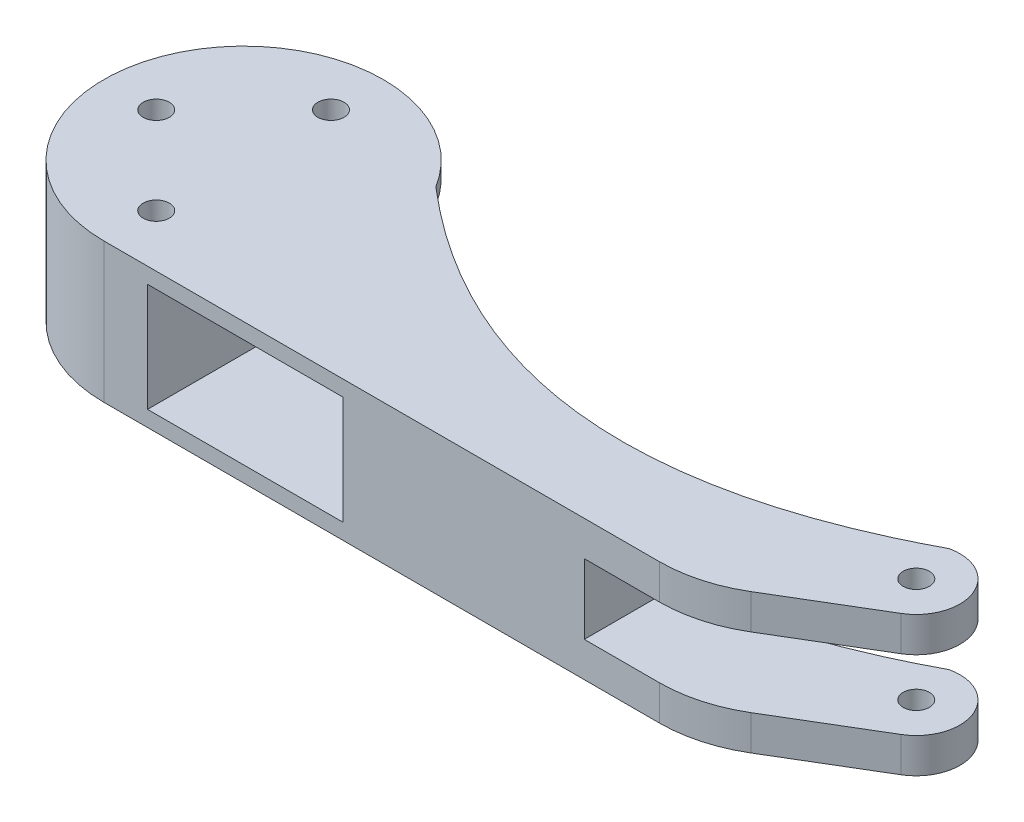
ISO-10303-21;
HEADER;
FILE_DESCRIPTION(('STEP AP214'),'2;1');
FILE_NAME('part.step','',(''),(''),'','','');
FILE_SCHEMA(('AUTOMOTIVE_DESIGN { 1 0 10303 214 1 1 1 1 }'));
ENDSEC;
DATA;
#1=APPLICATION_CONTEXT('core data for automotive mechanical design processes');
#2=APPLICATION_PROTOCOL_DEFINITION('international standard','automotive_design',2000,#1);
#3=PRODUCT_CONTEXT('',#1,'mechanical');
#4=PRODUCT('Part','Part','',(#3));
#5=PRODUCT_RELATED_PRODUCT_CATEGORY('part','',(#4));
#6=PRODUCT_DEFINITION_FORMATION('','',#4);
#7=PRODUCT_DEFINITION_CONTEXT('part definition',#1,'design');
#8=PRODUCT_DEFINITION('design','',#6,#7);
#9=PRODUCT_DEFINITION_SHAPE('','',#8);
#10=(LENGTH_UNIT() NAMED_UNIT(*) SI_UNIT(.MILLI.,.METRE.));
#11=(NAMED_UNIT(*) PLANE_ANGLE_UNIT() SI_UNIT($,.RADIAN.));
#12=(NAMED_UNIT(*) SI_UNIT($,.STERADIAN.) SOLID_ANGLE_UNIT());
#13=UNCERTAINTY_MEASURE_WITH_UNIT(LENGTH_MEASURE(1.E-05),#10,'distance_accuracy_value','');
#14=(GEOMETRIC_REPRESENTATION_CONTEXT(3) GLOBAL_UNCERTAINTY_ASSIGNED_CONTEXT((#13)) GLOBAL_UNIT_ASSIGNED_CONTEXT((#10,
#11,#12)) REPRESENTATION_CONTEXT('',''));
#15=CARTESIAN_POINT('',(0.,0.,0.));
#16=DIRECTION('',(0.,0.,1.));
#17=DIRECTION('',(1.,0.,0.));
#18=AXIS2_PLACEMENT_3D('',#15,#16,#17);
#19=CARTESIAN_POINT('',(7.56845608489065,16.,-14.0967539700132));
#20=CARTESIAN_POINT('',(39.625972236992,16.,19.0319670427114));
#21=CARTESIAN_POINT('',(78.8682656729972,16.,-1.87023381503225));
#22=B_SPLINE_CURVE_WITH_KNOTS('',2,(#19,#20,#21),.UNSPECIFIED.,.F.,.F.,(3,3),(0.,1.),.UNSPECIFIED.);
#23=DIRECTION('',(0.,-1.,0.));
#24=VECTOR('',#23,1.);
#25=SURFACE_OF_LINEAR_EXTRUSION('',#22,#24);
#26=DIRECTION('',(0.,-1.,0.));
#27=VECTOR('',#26,1.);
#28=CARTESIAN_POINT('',(27.4,16.,0.893138669633792));
#29=LINE('',#28,#27);
#30=CARTESIAN_POINT('',(27.4,1.8,0.893138669401314));
#31=VERTEX_POINT('',#30);
#32=CARTESIAN_POINT('',(27.4,14.2,0.893138669633791));
#33=VERTEX_POINT('',#32);
#34=EDGE_CURVE('E211',#31,#33,#29,.F.);
#35=ORIENTED_EDGE('',*,*,#34,.T.);
#36=CARTESIAN_POINT('',(7.56845608489065,14.2,-14.0967539700132));
#37=CARTESIAN_POINT('',(39.625972236992,14.2,19.0319670427114));
#38=CARTESIAN_POINT('',(78.8682656729972,14.2,-1.87023381503225));
#39=B_SPLINE_CURVE_WITH_KNOTS('',2,(#36,#37,#38),.UNSPECIFIED.,.F.,.F.,(3,3),(0.,1.),.UNSPECIFIED.);
#40=CARTESIAN_POINT('',(13.6420523189909,14.2,-8.36028758631638));
#41=VERTEX_POINT('',#40);
#42=EDGE_CURVE('E202',#33,#41,#39,.F.);
#43=ORIENTED_EDGE('',*,*,#42,.T.);
#44=DIRECTION('',(0.,-1.,0.));
#45=VECTOR('',#44,1.);
#46=CARTESIAN_POINT('',(13.6420523189909,16.,-8.36028758631638));
#47=LINE('',#46,#45);
#48=CARTESIAN_POINT('',(13.6420523189909,16.,-8.36028758631638));
#49=VERTEX_POINT('',#48);
#50=EDGE_CURVE('E403',#49,#41,#47,.T.);
#51=ORIENTED_EDGE('',*,*,#50,.F.);
#52=CARTESIAN_POINT('',(78.8682656729973,16.,-1.87023381503226));
#53=VERTEX_POINT('',#52);
#54=EDGE_CURVE('E284',#49,#53,#22,.T.);
#55=ORIENTED_EDGE('',*,*,#54,.T.);
#56=DIRECTION('',(0.,-1.,0.));
#57=VECTOR('',#56,1.);
#58=CARTESIAN_POINT('',(78.8682656729973,16.,-1.87023381503226));
#59=LINE('',#58,#57);
#60=CARTESIAN_POINT('',(78.8682656729973,12.,-1.87023381503226));
#61=VERTEX_POINT('',#60);
#62=EDGE_CURVE('E348',#53,#61,#59,.T.);
#63=ORIENTED_EDGE('',*,*,#62,.T.);
#64=CARTESIAN_POINT('',(7.56845608489065,12.,-14.0967539700132));
#65=CARTESIAN_POINT('',(39.625972236992,12.,19.0319670427114));
#66=CARTESIAN_POINT('',(78.8682656729972,12.,-1.87023381503225));
#67=B_SPLINE_CURVE_WITH_KNOTS('',2,(#64,#65,#66),.UNSPECIFIED.,.F.,.F.,(3,3),(0.,1.),.UNSPECIFIED.);
#68=CARTESIAN_POINT('',(55.,12.,5.92188664032105));
#69=VERTEX_POINT('',#68);
#70=EDGE_CURVE('E260',#61,#69,#67,.F.);
#71=ORIENTED_EDGE('',*,*,#70,.T.);
#72=DIRECTION('',(0.,-1.,0.));
#73=VECTOR('',#72,1.);
#74=CARTESIAN_POINT('',(55.,16.,5.92188664028552));
#75=LINE('',#74,#73);
#76=CARTESIAN_POINT('',(55.,4.,5.92188664032105));
#77=VERTEX_POINT('',#76);
#78=EDGE_CURVE('E273',#77,#69,#75,.F.);
#79=ORIENTED_EDGE('',*,*,#78,.F.);
#80=CARTESIAN_POINT('',(7.56845608489065,4.,-14.0967539700132));
#81=CARTESIAN_POINT('',(39.625972236992,4.,19.0319670427114));
#82=CARTESIAN_POINT('',(78.8682656729972,4.,-1.87023381503225));
#83=B_SPLINE_CURVE_WITH_KNOTS('',2,(#80,#81,#82),.UNSPECIFIED.,.F.,.F.,(3,3),(0.,1.),.UNSPECIFIED.);
#84=CARTESIAN_POINT('',(78.8682656729973,4.,-1.87023381503226));
#85=VERTEX_POINT('',#84);
#86=EDGE_CURVE('E242',#85,#77,#83,.F.);
#87=ORIENTED_EDGE('',*,*,#86,.F.);
#88=CARTESIAN_POINT('',(78.8682656729973,0.,-1.87023381503226));
#89=VERTEX_POINT('',#88);
#90=EDGE_CURVE('E401',#85,#89,#59,.T.);
#91=ORIENTED_EDGE('',*,*,#90,.T.);
#92=CARTESIAN_POINT('',(7.56845608489065,0.,-14.0967539700132));
#93=CARTESIAN_POINT('',(39.625972236992,0.,19.0319670427114));
#94=CARTESIAN_POINT('',(78.8682656729972,0.,-1.87023381503225));
#95=B_SPLINE_CURVE_WITH_KNOTS('',2,(#92,#93,#94),.UNSPECIFIED.,.F.,.F.,(3,3),(0.,1.),.UNSPECIFIED.);
#96=CARTESIAN_POINT('',(13.6420523189909,0.,-8.36028758631638));
#97=VERTEX_POINT('',#96);
#98=EDGE_CURVE('E425',#97,#89,#95,.T.);
#99=ORIENTED_EDGE('',*,*,#98,.F.);
#100=CARTESIAN_POINT('',(13.6420523189909,1.8,-8.36028758631638));
#101=VERTEX_POINT('',#100);
#102=EDGE_CURVE('E408',#101,#97,#47,.T.);
#103=ORIENTED_EDGE('',*,*,#102,.F.);
#104=CARTESIAN_POINT('',(7.56845608489065,1.8,-14.0967539700132));
#105=CARTESIAN_POINT('',(39.625972236992,1.8,19.0319670427114));
#106=CARTESIAN_POINT('',(78.8682656729972,1.8,-1.87023381503225));
#107=B_SPLINE_CURVE_WITH_KNOTS('',2,(#104,#105,#106),.UNSPECIFIED.,.F.,.F.,(3,3),(0.,1.),.UNSPECIFIED.);
#108=EDGE_CURVE('E192',#101,#31,#107,.T.);
#109=ORIENTED_EDGE('',*,*,#108,.T.);
#110=EDGE_LOOP('',(#35,#43,#51,#55,#63,#71,#79,#87,#91,#99,#103,#109));
#111=FACE_BOUND('',#110,.T.);
#112=ADVANCED_FACE('F44',(#111),#25,.T.);
#113=CARTESIAN_POINT('',(0.,16.,16.));
#114=DIRECTION('',(0.,0.,-1.));
#115=DIRECTION('',(-1.,0.,0.));
#116=AXIS2_PLACEMENT_3D('',#113,#114,#115);
#117=PLANE('',#116);
#118=DIRECTION('',(1.,0.,0.));
#119=VECTOR('',#118,1.);
#120=CARTESIAN_POINT('',(55.,12.,16.));
#121=LINE('',#120,#119);
#122=CARTESIAN_POINT('',(55.,12.,16.));
#123=VERTEX_POINT('',#122);
#124=CARTESIAN_POINT('',(63.5817220013536,12.,16.));
#125=VERTEX_POINT('',#124);
#126=EDGE_CURVE('E225',#123,#125,#121,.T.);
#127=ORIENTED_EDGE('',*,*,#126,.T.);
#128=DIRECTION('',(0.,-1.,0.));
#129=VECTOR('',#128,1.);
#130=CARTESIAN_POINT('',(63.5817220013536,16.,16.));
#131=LINE('',#130,#129);
#132=CARTESIAN_POINT('',(63.5817220013536,16.,16.));
#133=VERTEX_POINT('',#132);
#134=EDGE_CURVE('E356',#125,#133,#131,.F.);
#135=ORIENTED_EDGE('',*,*,#134,.T.);
#136=DIRECTION('',(1.,0.,0.));
#137=VECTOR('',#136,1.);
#138=CARTESIAN_POINT('',(0.,16.,16.));
#139=LINE('',#138,#137);
#140=CARTESIAN_POINT('',(0.,16.,16.));
#141=VERTEX_POINT('',#140);
#142=EDGE_CURVE('E379',#141,#133,#139,.T.);
#143=ORIENTED_EDGE('',*,*,#142,.F.);
#144=DIRECTION('',(0.,-1.,0.));
#145=VECTOR('',#144,1.);
#146=CARTESIAN_POINT('',(0.,16.,16.));
#147=LINE('',#146,#145);
#148=CARTESIAN_POINT('',(0.,0.,16.));
#149=VERTEX_POINT('',#148);
#150=EDGE_CURVE('E411',#141,#149,#147,.T.);
#151=ORIENTED_EDGE('',*,*,#150,.T.);
#152=DIRECTION('',(1.,0.,0.));
#153=VECTOR('',#152,1.);
#154=CARTESIAN_POINT('',(0.,0.,16.));
#155=LINE('',#154,#153);
#156=CARTESIAN_POINT('',(63.5817220013536,0.,16.));
#157=VERTEX_POINT('',#156);
#158=EDGE_CURVE('E418',#149,#157,#155,.T.);
#159=ORIENTED_EDGE('',*,*,#158,.T.);
#160=CARTESIAN_POINT('',(63.5817220013536,4.,16.));
#161=VERTEX_POINT('',#160);
#162=EDGE_CURVE('E357',#157,#161,#131,.F.);
#163=ORIENTED_EDGE('',*,*,#162,.T.);
#164=DIRECTION('',(1.,0.,0.));
#165=VECTOR('',#164,1.);
#166=CARTESIAN_POINT('',(55.,4.,16.));
#167=LINE('',#166,#165);
#168=CARTESIAN_POINT('',(55.,4.,16.));
#169=VERTEX_POINT('',#168);
#170=EDGE_CURVE('E222',#169,#161,#167,.T.);
#171=ORIENTED_EDGE('',*,*,#170,.F.);
#172=DIRECTION('',(0.,-1.,0.));
#173=VECTOR('',#172,1.);
#174=CARTESIAN_POINT('',(55.,12.,16.));
#175=LINE('',#174,#173);
#176=EDGE_CURVE('E218',#123,#169,#175,.T.);
#177=ORIENTED_EDGE('',*,*,#176,.F.);
#178=EDGE_LOOP('',(#127,#135,#143,#151,#159,#163,#171,#177));
#179=FACE_BOUND('',#178,.T.);
#180=DIRECTION('',(1.,0.,0.));
#181=VECTOR('',#180,1.);
#182=CARTESIAN_POINT('',(0.,14.2,16.));
#183=LINE('',#182,#181);
#184=CARTESIAN_POINT('',(5.,14.2,16.));
#185=VERTEX_POINT('',#184);
#186=CARTESIAN_POINT('',(27.4,14.2,16.));
#187=VERTEX_POINT('',#186);
#188=EDGE_CURVE('E60',#185,#187,#183,.T.);
#189=ORIENTED_EDGE('',*,*,#188,.T.);
#190=DIRECTION('',(0.,-1.,0.));
#191=VECTOR('',#190,1.);
#192=CARTESIAN_POINT('',(27.4,0.,16.));
#193=LINE('',#192,#191);
#194=CARTESIAN_POINT('',(27.4,1.8,16.));
#195=VERTEX_POINT('',#194);
#196=EDGE_CURVE('E182',#187,#195,#193,.T.);
#197=ORIENTED_EDGE('',*,*,#196,.T.);
#198=DIRECTION('',(-1.,0.,0.));
#199=VECTOR('',#198,1.);
#200=CARTESIAN_POINT('',(0.,1.8,16.));
#201=LINE('',#200,#199);
#202=CARTESIAN_POINT('',(5.,1.8,16.));
#203=VERTEX_POINT('',#202);
#204=EDGE_CURVE('E166',#195,#203,#201,.T.);
#205=ORIENTED_EDGE('',*,*,#204,.T.);
#206=DIRECTION('',(0.,-1.,0.));
#207=VECTOR('',#206,1.);
#208=CARTESIAN_POINT('',(5.,0.,16.));
#209=LINE('',#208,#207);
#210=EDGE_CURVE('E175',#185,#203,#209,.T.);
#211=ORIENTED_EDGE('',*,*,#210,.F.);
#212=EDGE_LOOP('',(#189,#197,#205,#211));
#213=FACE_BOUND('',#212,.T.);
#214=ADVANCED_FACE('F180',(#179,#213),#117,.F.);
#215=CARTESIAN_POINT('',(0.,16.,0.));
#216=DIRECTION('',(0.,-1.,0.));
#217=DIRECTION('',(0.,0.,-1.));
#218=AXIS2_PLACEMENT_3D('',#215,#216,#217);
#219=CYLINDRICAL_SURFACE('',#218,16.);
#220=CARTESIAN_POINT('',(0.,14.2,0.));
#221=DIRECTION('',(0.,-1.,0.));
#222=DIRECTION('',(0.,0.,-1.));
#223=AXIS2_PLACEMENT_3D('',#220,#221,#222);
#224=CIRCLE('',#223,16.);
#225=CARTESIAN_POINT('',(5.,14.2,-15.1986841535707));
#226=VERTEX_POINT('',#225);
#227=EDGE_CURVE('E11',#226,#41,#224,.T.);
#228=ORIENTED_EDGE('',*,*,#227,.F.);
#229=DIRECTION('',(0.,-1.,0.));
#230=VECTOR('',#229,1.);
#231=CARTESIAN_POINT('',(5.,16.,-15.1986841535707));
#232=LINE('',#231,#230);
#233=CARTESIAN_POINT('',(5.,1.8,-15.1986841535707));
#234=VERTEX_POINT('',#233);
#235=EDGE_CURVE('E370',#226,#234,#232,.T.);
#236=ORIENTED_EDGE('',*,*,#235,.T.);
#237=CARTESIAN_POINT('',(0.,1.8,0.));
#238=DIRECTION('',(0.,1.,0.));
#239=DIRECTION('',(-1.,0.,0.));
#240=AXIS2_PLACEMENT_3D('',#237,#238,#239);
#241=CIRCLE('',#240,16.);
#242=EDGE_CURVE('E53',#101,#234,#241,.T.);
#243=ORIENTED_EDGE('',*,*,#242,.F.);
#244=ORIENTED_EDGE('',*,*,#102,.T.);
#245=CARTESIAN_POINT('',(0.,0.,0.));
#246=DIRECTION('',(0.,1.,0.));
#247=DIRECTION('',(0.,0.,1.));
#248=AXIS2_PLACEMENT_3D('',#245,#246,#247);
#249=CIRCLE('',#248,16.);
#250=EDGE_CURVE('E422',#97,#149,#249,.T.);
#251=ORIENTED_EDGE('',*,*,#250,.T.);
#252=ORIENTED_EDGE('',*,*,#150,.F.);
#253=CARTESIAN_POINT('',(0.,16.,0.));
#254=DIRECTION('',(0.,1.,0.));
#255=DIRECTION('',(0.,0.,1.));
#256=AXIS2_PLACEMENT_3D('',#253,#254,#255);
#257=CIRCLE('',#256,16.);
#258=EDGE_CURVE('E291',#49,#141,#257,.T.);
#259=ORIENTED_EDGE('',*,*,#258,.F.);
#260=ORIENTED_EDGE('',*,*,#50,.T.);
#261=EDGE_LOOP('',(#228,#236,#243,#244,#251,#252,#259,#260));
#262=FACE_BOUND('',#261,.T.);
#263=ADVANCED_FACE('F301',(#262),#219,.T.);
#264=CARTESIAN_POINT('',(24.9532793959161,16.,41.7365802403214));
#265=DIRECTION('',(-0.513154363355281,0.,-0.858296335404874));
#266=DIRECTION('',(-0.858296335404874,0.,0.513154363355281));
#267=AXIS2_PLACEMENT_3D('',#264,#265,#266);
#268=PLANE('',#267);
#269=DIRECTION('',(-0.858296335404874,0.,0.513154363355281));
#270=VECTOR('',#269,1.);
#271=CARTESIAN_POINT('',(24.9532793959161,12.,41.7365802403214));
#272=LINE('',#271,#270);
#273=CARTESIAN_POINT('',(82.5657718167764,12.,7.29148167702438));
#274=VERTEX_POINT('',#273);
#275=CARTESIAN_POINT('',(71.7921918150381,12.,13.732741366478));
#276=VERTEX_POINT('',#275);
#277=EDGE_CURVE('E254',#274,#276,#272,.T.);
#278=ORIENTED_EDGE('',*,*,#277,.F.);
#279=DIRECTION('',(0.,-1.,0.));
#280=VECTOR('',#279,1.);
#281=CARTESIAN_POINT('',(82.5657718167764,16.,7.29148167702438));
#282=LINE('',#281,#280);
#283=CARTESIAN_POINT('',(82.5657718167764,16.,7.29148167702438));
#284=VERTEX_POINT('',#283);
#285=EDGE_CURVE('E332',#284,#274,#282,.T.);
#286=ORIENTED_EDGE('',*,*,#285,.F.);
#287=DIRECTION('',(0.858296335404874,0.,-0.513154363355281));
#288=VECTOR('',#287,1.);
#289=CARTESIAN_POINT('',(24.9532793959161,16.,41.7365802403214));
#290=LINE('',#289,#288);
#291=CARTESIAN_POINT('',(71.7921918150381,16.,13.732741366478));
#292=VERTEX_POINT('',#291);
#293=EDGE_CURVE('E277',#292,#284,#290,.T.);
#294=ORIENTED_EDGE('',*,*,#293,.F.);
#295=DIRECTION('',(0.,-1.,0.));
#296=VECTOR('',#295,1.);
#297=CARTESIAN_POINT('',(71.7921918150382,16.,13.732741366478));
#298=LINE('',#297,#296);
#299=EDGE_CURVE('E334',#292,#276,#298,.T.);
#300=ORIENTED_EDGE('',*,*,#299,.T.);
#301=EDGE_LOOP('',(#278,#286,#294,#300));
#302=FACE_BOUND('',#301,.T.);
#303=ADVANCED_FACE('F312',(#302),#268,.F.);
#304=CARTESIAN_POINT('',(80.,16.,3.));
#305=DIRECTION('',(0.,-1.,0.));
#306=DIRECTION('',(0.,0.,-1.));
#307=AXIS2_PLACEMENT_3D('',#304,#305,#306);
#308=CYLINDRICAL_SURFACE('',#307,5.);
#309=ORIENTED_EDGE('',*,*,#285,.T.);
#310=CARTESIAN_POINT('',(80.,12.,3.));
#311=DIRECTION('',(0.,-1.,0.));
#312=DIRECTION('',(0.,0.,-1.));
#313=AXIS2_PLACEMENT_3D('',#310,#311,#312);
#314=CIRCLE('',#313,5.);
#315=EDGE_CURVE('E257',#61,#274,#314,.T.);
#316=ORIENTED_EDGE('',*,*,#315,.F.);
#317=ORIENTED_EDGE('',*,*,#62,.F.);
#318=CARTESIAN_POINT('',(80.,16.,3.));
#319=DIRECTION('',(0.,1.,0.));
#320=DIRECTION('',(0.,0.,1.));
#321=AXIS2_PLACEMENT_3D('',#318,#319,#320);
#322=CIRCLE('',#321,5.);
#323=EDGE_CURVE('E280',#284,#53,#322,.T.);
#324=ORIENTED_EDGE('',*,*,#323,.F.);
#325=EDGE_LOOP('',(#309,#316,#317,#324));
#326=FACE_BOUND('',#325,.T.);
#327=ADVANCED_FACE('F308',(#326),#308,.T.);
#328=CARTESIAN_POINT('',(80.,16.,3.));
#329=DIRECTION('',(0.,-1.,0.));
#330=DIRECTION('',(0.,0.,-1.));
#331=AXIS2_PLACEMENT_3D('',#328,#329,#330);
#332=CYLINDRICAL_SURFACE('',#331,1.5);
#333=CARTESIAN_POINT('',(80.,16.,3.));
#334=DIRECTION('',(0.,1.,0.));
#335=DIRECTION('',(0.,0.,1.));
#336=AXIS2_PLACEMENT_3D('',#333,#334,#335);
#337=CIRCLE('',#336,1.5);
#338=CARTESIAN_POINT('',(80.,16.,4.5));
#339=VERTEX_POINT('',#338);
#340=EDGE_CURVE('E390',#339,#339,#337,.T.);
#341=ORIENTED_EDGE('',*,*,#340,.T.);
#342=EDGE_LOOP('',(#341));
#343=FACE_BOUND('',#342,.T.);
#344=CARTESIAN_POINT('',(80.,12.,3.));
#345=DIRECTION('',(0.,-1.,0.));
#346=DIRECTION('',(0.,0.,-1.));
#347=AXIS2_PLACEMENT_3D('',#344,#345,#346);
#348=CIRCLE('',#347,1.5);
#349=CARTESIAN_POINT('',(80.,12.,1.5));
#350=VERTEX_POINT('',#349);
#351=EDGE_CURVE('E266',#350,#350,#348,.T.);
#352=ORIENTED_EDGE('',*,*,#351,.T.);
#353=EDGE_LOOP('',(#352));
#354=FACE_BOUND('',#353,.T.);
#355=ADVANCED_FACE('F316',(#343,#354),#332,.F.);
#356=CARTESIAN_POINT('',(63.5817220013536,16.,0.));
#357=DIRECTION('',(0.,-1.,0.));
#358=DIRECTION('',(0.,0.,-1.));
#359=AXIS2_PLACEMENT_3D('',#356,#357,#358);
#360=CYLINDRICAL_SURFACE('',#359,16.);
#361=ORIENTED_EDGE('',*,*,#134,.F.);
#362=CARTESIAN_POINT('',(63.5817220013536,12.,0.));
#363=DIRECTION('',(0.,-1.,0.));
#364=DIRECTION('',(0.,0.,-1.));
#365=AXIS2_PLACEMENT_3D('',#362,#363,#364);
#366=CIRCLE('',#365,16.);
#367=EDGE_CURVE('E367',#125,#276,#366,.F.);
#368=ORIENTED_EDGE('',*,*,#367,.T.);
#369=ORIENTED_EDGE('',*,*,#299,.F.);
#370=CARTESIAN_POINT('',(63.5817220013536,16.,0.));
#371=DIRECTION('',(0.,1.,0.));
#372=DIRECTION('',(0.,0.,1.));
#373=AXIS2_PLACEMENT_3D('',#370,#371,#372);
#374=CIRCLE('',#373,16.);
#375=EDGE_CURVE('E361',#133,#292,#374,.T.);
#376=ORIENTED_EDGE('',*,*,#375,.F.);
#377=EDGE_LOOP('',(#361,#368,#369,#376));
#378=FACE_BOUND('',#377,.T.);
#379=ADVANCED_FACE('F310',(#378),#360,.T.);
#380=CARTESIAN_POINT('',(82.5657718167764,4.,7.29148167702438));
#381=VERTEX_POINT('',#380);
#382=CARTESIAN_POINT('',(82.5657718167764,0.,7.29148167702438));
#383=VERTEX_POINT('',#382);
#384=EDGE_CURVE('E343',#381,#383,#282,.T.);
#385=ORIENTED_EDGE('',*,*,#384,.F.);
#386=DIRECTION('',(-0.858296335404874,0.,0.513154363355281));
#387=VECTOR('',#386,1.);
#388=CARTESIAN_POINT('',(24.9532793959161,4.,41.7365802403214));
#389=LINE('',#388,#387);
#390=CARTESIAN_POINT('',(71.7921918150381,4.,13.732741366478));
#391=VERTEX_POINT('',#390);
#392=EDGE_CURVE('E233',#381,#391,#389,.T.);
#393=ORIENTED_EDGE('',*,*,#392,.T.);
#394=CARTESIAN_POINT('',(71.7921918150381,0.,13.732741366478));
#395=VERTEX_POINT('',#394);
#396=EDGE_CURVE('E342',#391,#395,#298,.T.);
#397=ORIENTED_EDGE('',*,*,#396,.T.);
#398=DIRECTION('',(0.858296335404874,0.,-0.513154363355281));
#399=VECTOR('',#398,1.);
#400=CARTESIAN_POINT('',(24.9532793959161,0.,41.7365802403214));
#401=LINE('',#400,#399);
#402=EDGE_CURVE('E276',#395,#383,#401,.T.);
#403=ORIENTED_EDGE('',*,*,#402,.T.);
#404=EDGE_LOOP('',(#385,#393,#397,#403));
#405=FACE_BOUND('',#404,.T.);
#406=ADVANCED_FACE('F306',(#405),#268,.F.);
#407=CARTESIAN_POINT('',(80.,4.,3.));
#408=DIRECTION('',(0.,-1.,0.));
#409=DIRECTION('',(0.,0.,-1.));
#410=AXIS2_PLACEMENT_3D('',#407,#408,#409);
#411=CIRCLE('',#410,5.);
#412=EDGE_CURVE('E239',#85,#381,#411,.T.);
#413=ORIENTED_EDGE('',*,*,#412,.T.);
#414=ORIENTED_EDGE('',*,*,#384,.T.);
#415=CARTESIAN_POINT('',(80.,0.,3.));
#416=DIRECTION('',(0.,1.,0.));
#417=DIRECTION('',(0.,0.,1.));
#418=AXIS2_PLACEMENT_3D('',#415,#416,#417);
#419=CIRCLE('',#418,5.);
#420=EDGE_CURVE('E431',#383,#89,#419,.T.);
#421=ORIENTED_EDGE('',*,*,#420,.T.);
#422=ORIENTED_EDGE('',*,*,#90,.F.);
#423=EDGE_LOOP('',(#413,#414,#421,#422));
#424=FACE_BOUND('',#423,.T.);
#425=ADVANCED_FACE('F303',(#424),#308,.T.);
#426=CARTESIAN_POINT('',(80.,4.,3.));
#427=DIRECTION('',(0.,-1.,0.));
#428=DIRECTION('',(0.,0.,-1.));
#429=AXIS2_PLACEMENT_3D('',#426,#427,#428);
#430=CIRCLE('',#429,1.5);
#431=CARTESIAN_POINT('',(80.,4.,1.5));
#432=VERTEX_POINT('',#431);
#433=EDGE_CURVE('E247',#432,#432,#430,.T.);
#434=ORIENTED_EDGE('',*,*,#433,.F.);
#435=EDGE_LOOP('',(#434));
#436=FACE_BOUND('',#435,.T.);
#437=CARTESIAN_POINT('',(80.,0.,3.));
#438=DIRECTION('',(0.,1.,0.));
#439=DIRECTION('',(0.,0.,1.));
#440=AXIS2_PLACEMENT_3D('',#437,#438,#439);
#441=CIRCLE('',#440,1.5);
#442=CARTESIAN_POINT('',(80.,0.,4.5));
#443=VERTEX_POINT('',#442);
#444=EDGE_CURVE('E281',#443,#443,#441,.T.);
#445=ORIENTED_EDGE('',*,*,#444,.F.);
#446=EDGE_LOOP('',(#445));
#447=FACE_BOUND('',#446,.T.);
#448=ADVANCED_FACE('F305',(#436,#447),#332,.F.);
#449=CARTESIAN_POINT('',(0.,16.,0.));
#450=DIRECTION('',(0.,1.,0.));
#451=DIRECTION('',(0.,0.,1.));
#452=AXIS2_PLACEMENT_3D('',#449,#450,#451);
#453=PLANE('',#452);
#454=CARTESIAN_POINT('',(0.,16.,-10.));
#455=DIRECTION('',(0.,-1.,0.));
#456=DIRECTION('',(0.,0.,-1.));
#457=AXIS2_PLACEMENT_3D('',#454,#455,#456);
#458=CIRCLE('',#457,1.5);
#459=CARTESIAN_POINT('',(0.,16.,-11.5));
#460=VERTEX_POINT('',#459);
#461=EDGE_CURVE('E730',#460,#460,#458,.T.);
#462=ORIENTED_EDGE('',*,*,#461,.T.);
#463=EDGE_LOOP('',(#462));
#464=FACE_BOUND('',#463,.T.);
#465=CARTESIAN_POINT('',(-10.,16.,0.));
#466=DIRECTION('',(0.,-1.,0.));
#467=DIRECTION('',(0.,0.,-1.));
#468=AXIS2_PLACEMENT_3D('',#465,#466,#467);
#469=CIRCLE('',#468,1.5);
#470=CARTESIAN_POINT('',(-10.,16.,-1.5));
#471=VERTEX_POINT('',#470);
#472=EDGE_CURVE('E743',#471,#471,#469,.T.);
#473=ORIENTED_EDGE('',*,*,#472,.T.);
#474=EDGE_LOOP('',(#473));
#475=FACE_BOUND('',#474,.T.);
#476=CARTESIAN_POINT('',(0.,16.,10.));
#477=DIRECTION('',(0.,-1.,0.));
#478=DIRECTION('',(0.,0.,-1.));
#479=AXIS2_PLACEMENT_3D('',#476,#477,#478);
#480=CIRCLE('',#479,1.5);
#481=CARTESIAN_POINT('',(0.,16.,8.5));
#482=VERTEX_POINT('',#481);
#483=EDGE_CURVE('E735',#482,#482,#480,.T.);
#484=ORIENTED_EDGE('',*,*,#483,.T.);
#485=EDGE_LOOP('',(#484));
#486=FACE_BOUND('',#485,.T.);
#487=ORIENTED_EDGE('',*,*,#142,.T.);
#488=ORIENTED_EDGE('',*,*,#375,.T.);
#489=ORIENTED_EDGE('',*,*,#293,.T.);
#490=ORIENTED_EDGE('',*,*,#323,.T.);
#491=ORIENTED_EDGE('',*,*,#54,.F.);
#492=ORIENTED_EDGE('',*,*,#258,.T.);
#493=EDGE_LOOP('',(#487,#488,#489,#490,#491,#492));
#494=FACE_BOUND('',#493,.T.);
#495=ORIENTED_EDGE('',*,*,#340,.F.);
#496=EDGE_LOOP('',(#495));
#497=FACE_BOUND('',#496,.T.);
#498=ADVANCED_FACE('F384',(#464,#475,#486,#494,#497),#453,.T.);
#499=CARTESIAN_POINT('',(0.,0.,0.));
#500=DIRECTION('',(0.,1.,0.));
#501=DIRECTION('',(0.,0.,1.));
#502=AXIS2_PLACEMENT_3D('',#499,#500,#501);
#503=PLANE('',#502);
#504=CARTESIAN_POINT('',(0.,0.,-10.));
#505=DIRECTION('',(0.,-1.,0.));
#506=DIRECTION('',(0.,0.,-1.));
#507=AXIS2_PLACEMENT_3D('',#504,#505,#506);
#508=CIRCLE('',#507,1.5);
#509=CARTESIAN_POINT('',(0.,0.,-11.5));
#510=VERTEX_POINT('',#509);
#511=EDGE_CURVE('E732',#510,#510,#508,.T.);
#512=ORIENTED_EDGE('',*,*,#511,.F.);
#513=EDGE_LOOP('',(#512));
#514=FACE_BOUND('',#513,.T.);
#515=CARTESIAN_POINT('',(-10.,0.,0.));
#516=DIRECTION('',(0.,-1.,0.));
#517=DIRECTION('',(0.,0.,-1.));
#518=AXIS2_PLACEMENT_3D('',#515,#516,#517);
#519=CIRCLE('',#518,1.5);
#520=CARTESIAN_POINT('',(-10.,0.,-1.5));
#521=VERTEX_POINT('',#520);
#522=EDGE_CURVE('E747',#521,#521,#519,.T.);
#523=ORIENTED_EDGE('',*,*,#522,.F.);
#524=EDGE_LOOP('',(#523));
#525=FACE_BOUND('',#524,.T.);
#526=CARTESIAN_POINT('',(0.,0.,10.));
#527=DIRECTION('',(0.,-1.,0.));
#528=DIRECTION('',(0.,0.,-1.));
#529=AXIS2_PLACEMENT_3D('',#526,#527,#528);
#530=CIRCLE('',#529,1.5);
#531=CARTESIAN_POINT('',(0.,0.,8.5));
#532=VERTEX_POINT('',#531);
#533=EDGE_CURVE('E739',#532,#532,#530,.T.);
#534=ORIENTED_EDGE('',*,*,#533,.F.);
#535=EDGE_LOOP('',(#534));
#536=FACE_BOUND('',#535,.T.);
#537=ORIENTED_EDGE('',*,*,#402,.F.);
#538=CARTESIAN_POINT('',(63.5817220013536,0.,0.));
#539=DIRECTION('',(0.,1.,0.));
#540=DIRECTION('',(0.,0.,1.));
#541=AXIS2_PLACEMENT_3D('',#538,#539,#540);
#542=CIRCLE('',#541,16.);
#543=EDGE_CURVE('E353',#395,#157,#542,.F.);
#544=ORIENTED_EDGE('',*,*,#543,.T.);
#545=ORIENTED_EDGE('',*,*,#158,.F.);
#546=ORIENTED_EDGE('',*,*,#250,.F.);
#547=ORIENTED_EDGE('',*,*,#98,.T.);
#548=ORIENTED_EDGE('',*,*,#420,.F.);
#549=EDGE_LOOP('',(#537,#544,#545,#546,#547,#548));
#550=FACE_BOUND('',#549,.T.);
#551=ORIENTED_EDGE('',*,*,#444,.T.);
#552=EDGE_LOOP('',(#551));
#553=FACE_BOUND('',#552,.T.);
#554=ADVANCED_FACE('F446',(#514,#525,#536,#550,#553),#503,.F.);
#555=CARTESIAN_POINT('',(63.5817220013536,4.,0.));
#556=DIRECTION('',(0.,-1.,0.));
#557=DIRECTION('',(0.,0.,-1.));
#558=AXIS2_PLACEMENT_3D('',#555,#556,#557);
#559=CIRCLE('',#558,16.);
#560=EDGE_CURVE('E364',#161,#391,#559,.F.);
#561=ORIENTED_EDGE('',*,*,#560,.F.);
#562=ORIENTED_EDGE('',*,*,#162,.F.);
#563=ORIENTED_EDGE('',*,*,#543,.F.);
#564=ORIENTED_EDGE('',*,*,#396,.F.);
#565=EDGE_LOOP('',(#561,#562,#563,#564));
#566=FACE_BOUND('',#565,.T.);
#567=ADVANCED_FACE('F46',(#566),#360,.T.);
#568=CARTESIAN_POINT('',(55.,12.,-16.));
#569=DIRECTION('',(0.,-1.,0.));
#570=DIRECTION('',(0.,0.,-1.));
#571=AXIS2_PLACEMENT_3D('',#568,#569,#570);
#572=PLANE('',#571);
#573=ORIENTED_EDGE('',*,*,#351,.F.);
#574=EDGE_LOOP('',(#573));
#575=FACE_BOUND('',#574,.T.);
#576=ORIENTED_EDGE('',*,*,#315,.T.);
#577=ORIENTED_EDGE('',*,*,#277,.T.);
#578=ORIENTED_EDGE('',*,*,#367,.F.);
#579=ORIENTED_EDGE('',*,*,#126,.F.);
#580=DIRECTION('',(0.,0.,1.));
#581=VECTOR('',#580,1.);
#582=CARTESIAN_POINT('',(55.,12.,-16.));
#583=LINE('',#582,#581);
#584=EDGE_CURVE('E230',#69,#123,#583,.T.);
#585=ORIENTED_EDGE('',*,*,#584,.F.);
#586=ORIENTED_EDGE('',*,*,#70,.F.);
#587=EDGE_LOOP('',(#576,#577,#578,#579,#585,#586));
#588=FACE_BOUND('',#587,.T.);
#589=ADVANCED_FACE('F391',(#575,#588),#572,.T.);
#590=CARTESIAN_POINT('',(55.,4.,-16.));
#591=DIRECTION('',(0.,-1.,0.));
#592=DIRECTION('',(0.,0.,-1.));
#593=AXIS2_PLACEMENT_3D('',#590,#591,#592);
#594=PLANE('',#593);
#595=ORIENTED_EDGE('',*,*,#433,.T.);
#596=EDGE_LOOP('',(#595));
#597=FACE_BOUND('',#596,.T.);
#598=ORIENTED_EDGE('',*,*,#86,.T.);
#599=DIRECTION('',(0.,0.,1.));
#600=VECTOR('',#599,1.);
#601=CARTESIAN_POINT('',(55.,4.,-16.));
#602=LINE('',#601,#600);
#603=EDGE_CURVE('E229',#77,#169,#602,.T.);
#604=ORIENTED_EDGE('',*,*,#603,.T.);
#605=ORIENTED_EDGE('',*,*,#170,.T.);
#606=ORIENTED_EDGE('',*,*,#560,.T.);
#607=ORIENTED_EDGE('',*,*,#392,.F.);
#608=ORIENTED_EDGE('',*,*,#412,.F.);
#609=EDGE_LOOP('',(#598,#604,#605,#606,#607,#608));
#610=FACE_BOUND('',#609,.T.);
#611=ADVANCED_FACE('F597',(#597,#610),#594,.F.);
#612=CARTESIAN_POINT('',(55.,12.,-16.));
#613=DIRECTION('',(-1.,0.,0.));
#614=DIRECTION('',(0.,0.,1.));
#615=AXIS2_PLACEMENT_3D('',#612,#613,#614);
#616=PLANE('',#615);
#617=ORIENTED_EDGE('',*,*,#78,.T.);
#618=ORIENTED_EDGE('',*,*,#584,.T.);
#619=ORIENTED_EDGE('',*,*,#176,.T.);
#620=ORIENTED_EDGE('',*,*,#603,.F.);
#621=EDGE_LOOP('',(#617,#618,#619,#620));
#622=FACE_BOUND('',#621,.T.);
#623=ADVANCED_FACE('F396',(#622),#616,.F.);
#624=CARTESIAN_POINT('',(5.,0.,-16.));
#625=DIRECTION('',(-1.,0.,0.));
#626=DIRECTION('',(0.,-1.,0.));
#627=AXIS2_PLACEMENT_3D('',#624,#625,#626);
#628=PLANE('',#627);
#629=DIRECTION('',(0.,0.,1.));
#630=VECTOR('',#629,1.);
#631=CARTESIAN_POINT('',(5.,14.2,-16.));
#632=LINE('',#631,#630);
#633=EDGE_CURVE('E172',#226,#185,#632,.T.);
#634=ORIENTED_EDGE('',*,*,#633,.T.);
#635=ORIENTED_EDGE('',*,*,#210,.T.);
#636=DIRECTION('',(0.,0.,1.));
#637=VECTOR('',#636,1.);
#638=CARTESIAN_POINT('',(5.,1.8,-16.));
#639=LINE('',#638,#637);
#640=EDGE_CURVE('E68',#234,#203,#639,.T.);
#641=ORIENTED_EDGE('',*,*,#640,.F.);
#642=ORIENTED_EDGE('',*,*,#235,.F.);
#643=EDGE_LOOP('',(#634,#635,#641,#642));
#644=FACE_BOUND('',#643,.T.);
#645=ADVANCED_FACE('F176',(#644),#628,.F.);
#646=CARTESIAN_POINT('',(0.,14.2,-16.));
#647=DIRECTION('',(0.,-1.,0.));
#648=DIRECTION('',(0.,0.,-1.));
#649=AXIS2_PLACEMENT_3D('',#646,#647,#648);
#650=PLANE('',#649);
#651=DIRECTION('',(0.,0.,1.));
#652=VECTOR('',#651,1.);
#653=CARTESIAN_POINT('',(27.4,14.2,-16.));
#654=LINE('',#653,#652);
#655=EDGE_CURVE('E189',#33,#187,#654,.T.);
#656=ORIENTED_EDGE('',*,*,#655,.T.);
#657=ORIENTED_EDGE('',*,*,#188,.F.);
#658=ORIENTED_EDGE('',*,*,#633,.F.);
#659=ORIENTED_EDGE('',*,*,#227,.T.);
#660=ORIENTED_EDGE('',*,*,#42,.F.);
#661=EDGE_LOOP('',(#656,#657,#658,#659,#660));
#662=FACE_BOUND('',#661,.T.);
#663=ADVANCED_FACE('F481',(#662),#650,.T.);
#664=CARTESIAN_POINT('',(27.4,0.,-16.));
#665=DIRECTION('',(-1.,0.,0.));
#666=DIRECTION('',(0.,0.,1.));
#667=AXIS2_PLACEMENT_3D('',#664,#665,#666);
#668=PLANE('',#667);
#669=DIRECTION('',(0.,0.,1.));
#670=VECTOR('',#669,1.);
#671=CARTESIAN_POINT('',(27.4,1.8,-16.));
#672=LINE('',#671,#670);
#673=EDGE_CURVE('E171',#31,#195,#672,.T.);
#674=ORIENTED_EDGE('',*,*,#673,.T.);
#675=ORIENTED_EDGE('',*,*,#196,.F.);
#676=ORIENTED_EDGE('',*,*,#655,.F.);
#677=ORIENTED_EDGE('',*,*,#34,.F.);
#678=EDGE_LOOP('',(#674,#675,#676,#677));
#679=FACE_BOUND('',#678,.T.);
#680=ADVANCED_FACE('F494',(#679),#668,.T.);
#681=CARTESIAN_POINT('',(0.,1.8,-16.));
#682=DIRECTION('',(0.,1.,0.));
#683=DIRECTION('',(-1.,0.,0.));
#684=AXIS2_PLACEMENT_3D('',#681,#682,#683);
#685=PLANE('',#684);
#686=ORIENTED_EDGE('',*,*,#242,.T.);
#687=ORIENTED_EDGE('',*,*,#640,.T.);
#688=ORIENTED_EDGE('',*,*,#204,.F.);
#689=ORIENTED_EDGE('',*,*,#673,.F.);
#690=ORIENTED_EDGE('',*,*,#108,.F.);
#691=EDGE_LOOP('',(#686,#687,#688,#689,#690));
#692=FACE_BOUND('',#691,.T.);
#693=ADVANCED_FACE('F163',(#692),#685,.T.);
#694=CARTESIAN_POINT('',(0.,16.,10.));
#695=DIRECTION('',(0.,-1.,0.));
#696=DIRECTION('',(0.,0.,-1.));
#697=AXIS2_PLACEMENT_3D('',#694,#695,#696);
#698=CYLINDRICAL_SURFACE('',#697,1.5);
#699=ORIENTED_EDGE('',*,*,#483,.F.);
#700=EDGE_LOOP('',(#699));
#701=FACE_BOUND('',#700,.T.);
#702=ORIENTED_EDGE('',*,*,#533,.T.);
#703=EDGE_LOOP('',(#702));
#704=FACE_BOUND('',#703,.T.);
#705=ADVANCED_FACE('F514',(#701,#704),#698,.F.);
#706=CARTESIAN_POINT('',(-10.,16.,0.));
#707=DIRECTION('',(0.,-1.,0.));
#708=DIRECTION('',(0.,0.,-1.));
#709=AXIS2_PLACEMENT_3D('',#706,#707,#708);
#710=CYLINDRICAL_SURFACE('',#709,1.5);
#711=ORIENTED_EDGE('',*,*,#472,.F.);
#712=EDGE_LOOP('',(#711));
#713=FACE_BOUND('',#712,.T.);
#714=ORIENTED_EDGE('',*,*,#522,.T.);
#715=EDGE_LOOP('',(#714));
#716=FACE_BOUND('',#715,.T.);
#717=ADVANCED_FACE('F540',(#713,#716),#710,.F.);
#718=CARTESIAN_POINT('',(0.,16.,-10.));
#719=DIRECTION('',(0.,-1.,0.));
#720=DIRECTION('',(0.,0.,-1.));
#721=AXIS2_PLACEMENT_3D('',#718,#719,#720);
#722=CYLINDRICAL_SURFACE('',#721,1.5);
#723=ORIENTED_EDGE('',*,*,#461,.F.);
#724=EDGE_LOOP('',(#723));
#725=FACE_BOUND('',#724,.T.);
#726=ORIENTED_EDGE('',*,*,#511,.T.);
#727=EDGE_LOOP('',(#726));
#728=FACE_BOUND('',#727,.T.);
#729=ADVANCED_FACE('F551',(#725,#728),#722,.F.);
#730=CLOSED_SHELL('',(#112,#214,#263,#303,#327,#355,#379,#406,#425,#448,#498,#554,#567,#589,
#611,#623,#645,#663,#680,#693,#705,#717,#729));
#731=MANIFOLD_SOLID_BREP('B2',#730);
#732=ADVANCED_BREP_SHAPE_REPRESENTATION('',(#18,#731),#14);
#733=SHAPE_DEFINITION_REPRESENTATION(#9,#732);
ENDSEC;
END-ISO-10303-21;
